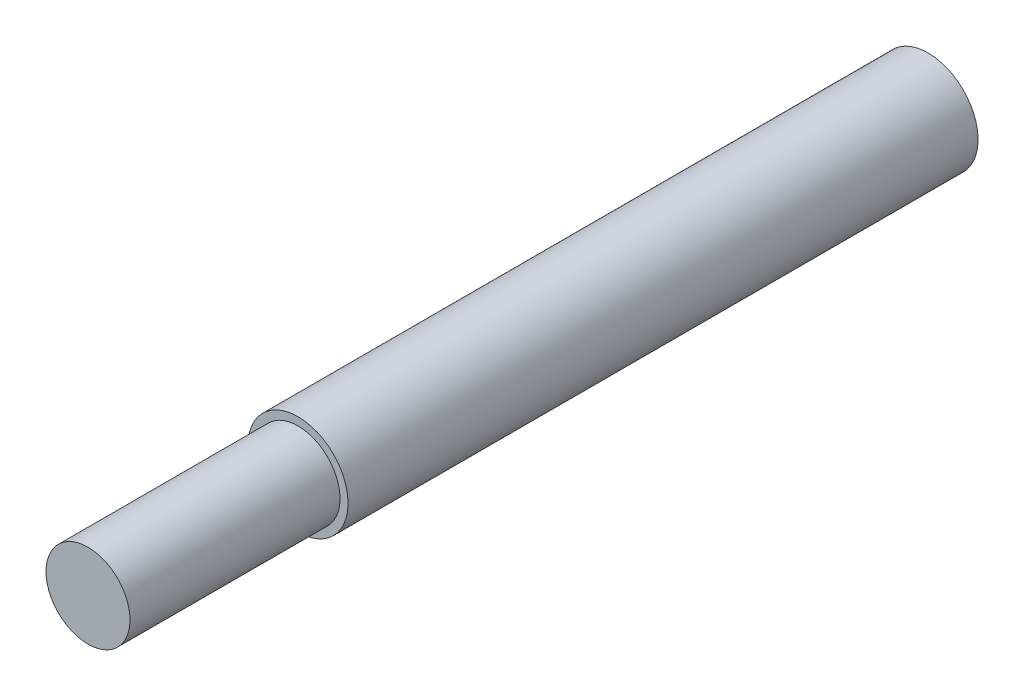
ISO-10303-21;
HEADER;
FILE_DESCRIPTION(('STEP AP214'),'2;1');
FILE_NAME('part.step','',(''),(''),'','','');
FILE_SCHEMA(('AUTOMOTIVE_DESIGN { 1 0 10303 214 1 1 1 1 }'));
ENDSEC;
DATA;
#1=APPLICATION_CONTEXT('core data for automotive mechanical design processes');
#2=APPLICATION_PROTOCOL_DEFINITION('international standard','automotive_design',2000,#1);
#3=PRODUCT_CONTEXT('',#1,'mechanical');
#4=PRODUCT('Part','Part','',(#3));
#5=PRODUCT_RELATED_PRODUCT_CATEGORY('part','',(#4));
#6=PRODUCT_DEFINITION_FORMATION('','',#4);
#7=PRODUCT_DEFINITION_CONTEXT('part definition',#1,'design');
#8=PRODUCT_DEFINITION('design','',#6,#7);
#9=PRODUCT_DEFINITION_SHAPE('','',#8);
#10=(LENGTH_UNIT() NAMED_UNIT(*) SI_UNIT(.MILLI.,.METRE.));
#11=(NAMED_UNIT(*) PLANE_ANGLE_UNIT() SI_UNIT($,.RADIAN.));
#12=(NAMED_UNIT(*) SI_UNIT($,.STERADIAN.) SOLID_ANGLE_UNIT());
#13=UNCERTAINTY_MEASURE_WITH_UNIT(LENGTH_MEASURE(1.E-05),#10,'distance_accuracy_value','');
#14=(GEOMETRIC_REPRESENTATION_CONTEXT(3) GLOBAL_UNCERTAINTY_ASSIGNED_CONTEXT((#13)) GLOBAL_UNIT_ASSIGNED_CONTEXT((#10,
#11,#12)) REPRESENTATION_CONTEXT('',''));
#15=CARTESIAN_POINT('',(0.,0.,0.));
#16=DIRECTION('',(0.,0.,1.));
#17=DIRECTION('',(1.,0.,0.));
#18=AXIS2_PLACEMENT_3D('',#15,#16,#17);
#19=CARTESIAN_POINT('',(0.,0.,20.));
#20=DIRECTION('',(0.,0.,-1.));
#21=DIRECTION('',(-1.,0.,0.));
#22=AXIS2_PLACEMENT_3D('',#19,#20,#21);
#23=CYLINDRICAL_SURFACE('',#22,4.);
#24=CARTESIAN_POINT('',(0.,0.,20.));
#25=DIRECTION('',(0.,0.,1.));
#26=DIRECTION('',(1.,0.,0.));
#27=AXIS2_PLACEMENT_3D('',#24,#25,#26);
#28=CIRCLE('',#27,4.);
#29=CARTESIAN_POINT('',(4.,0.,20.));
#30=VERTEX_POINT('',#29);
#31=EDGE_CURVE('E10',#30,#30,#28,.T.);
#32=ORIENTED_EDGE('',*,*,#31,.F.);
#33=EDGE_LOOP('',(#32));
#34=FACE_BOUND('',#33,.T.);
#35=CARTESIAN_POINT('',(0.,0.,0.));
#36=DIRECTION('',(0.,0.,-1.));
#37=DIRECTION('',(-1.,0.,0.));
#38=AXIS2_PLACEMENT_3D('',#35,#36,#37);
#39=CIRCLE('',#38,4.);
#40=CARTESIAN_POINT('',(-4.,0.,0.));
#41=VERTEX_POINT('',#40);
#42=EDGE_CURVE('E35',#41,#41,#39,.T.);
#43=ORIENTED_EDGE('',*,*,#42,.F.);
#44=EDGE_LOOP('',(#43));
#45=FACE_BOUND('',#44,.T.);
#46=ADVANCED_FACE('F29',(#34,#45),#23,.T.);
#47=CARTESIAN_POINT('',(0.,0.,20.));
#48=DIRECTION('',(0.,0.,1.));
#49=DIRECTION('',(1.,0.,0.));
#50=AXIS2_PLACEMENT_3D('',#47,#48,#49);
#51=PLANE('',#50);
#52=ORIENTED_EDGE('',*,*,#31,.T.);
#53=EDGE_LOOP('',(#52));
#54=FACE_BOUND('',#53,.T.);
#55=ADVANCED_FACE('F53',(#54),#51,.T.);
#56=CARTESIAN_POINT('',(0.,0.,0.));
#57=DIRECTION('',(0.,0.,-1.));
#58=DIRECTION('',(-1.,0.,0.));
#59=AXIS2_PLACEMENT_3D('',#56,#57,#58);
#60=PLANE('',#59);
#61=CARTESIAN_POINT('',(0.,0.,0.));
#62=DIRECTION('',(0.,0.,-1.));
#63=DIRECTION('',(-1.,0.,0.));
#64=AXIS2_PLACEMENT_3D('',#61,#62,#63);
#65=CIRCLE('',#64,4.7625);
#66=CARTESIAN_POINT('',(-4.7625,0.,0.));
#67=VERTEX_POINT('',#66);
#68=EDGE_CURVE('E43',#67,#67,#65,.T.);
#69=ORIENTED_EDGE('',*,*,#68,.F.);
#70=EDGE_LOOP('',(#69));
#71=FACE_BOUND('',#70,.T.);
#72=ORIENTED_EDGE('',*,*,#42,.T.);
#73=EDGE_LOOP('',(#72));
#74=FACE_BOUND('',#73,.T.);
#75=ADVANCED_FACE('F51',(#71,#74),#60,.F.);
#76=CARTESIAN_POINT('',(0.,0.,-60.));
#77=DIRECTION('',(0.,0.,1.));
#78=DIRECTION('',(1.,0.,0.));
#79=AXIS2_PLACEMENT_3D('',#76,#77,#78);
#80=CYLINDRICAL_SURFACE('',#79,4.7625);
#81=CARTESIAN_POINT('',(0.,0.,-60.));
#82=DIRECTION('',(0.,0.,-1.));
#83=DIRECTION('',(-1.,0.,0.));
#84=AXIS2_PLACEMENT_3D('',#81,#82,#83);
#85=CIRCLE('',#84,4.7625);
#86=CARTESIAN_POINT('',(-4.7625,0.,-60.));
#87=VERTEX_POINT('',#86);
#88=EDGE_CURVE('E39',#87,#87,#85,.T.);
#89=ORIENTED_EDGE('',*,*,#88,.F.);
#90=EDGE_LOOP('',(#89));
#91=FACE_BOUND('',#90,.T.);
#92=ORIENTED_EDGE('',*,*,#68,.T.);
#93=EDGE_LOOP('',(#92));
#94=FACE_BOUND('',#93,.T.);
#95=ADVANCED_FACE('F49',(#91,#94),#80,.T.);
#96=CARTESIAN_POINT('',(0.,0.,-60.));
#97=DIRECTION('',(0.,0.,-1.));
#98=DIRECTION('',(-1.,0.,0.));
#99=AXIS2_PLACEMENT_3D('',#96,#97,#98);
#100=PLANE('',#99);
#101=ORIENTED_EDGE('',*,*,#88,.T.);
#102=EDGE_LOOP('',(#101));
#103=FACE_BOUND('',#102,.T.);
#104=ADVANCED_FACE('F59',(#103),#100,.T.);
#105=CLOSED_SHELL('',(#46,#55,#75,#95,#104));
#106=MANIFOLD_SOLID_BREP('B2',#105);
#107=ADVANCED_BREP_SHAPE_REPRESENTATION('',(#18,#106),#14);
#108=SHAPE_DEFINITION_REPRESENTATION(#9,#107);
ENDSEC;
END-ISO-10303-21;
